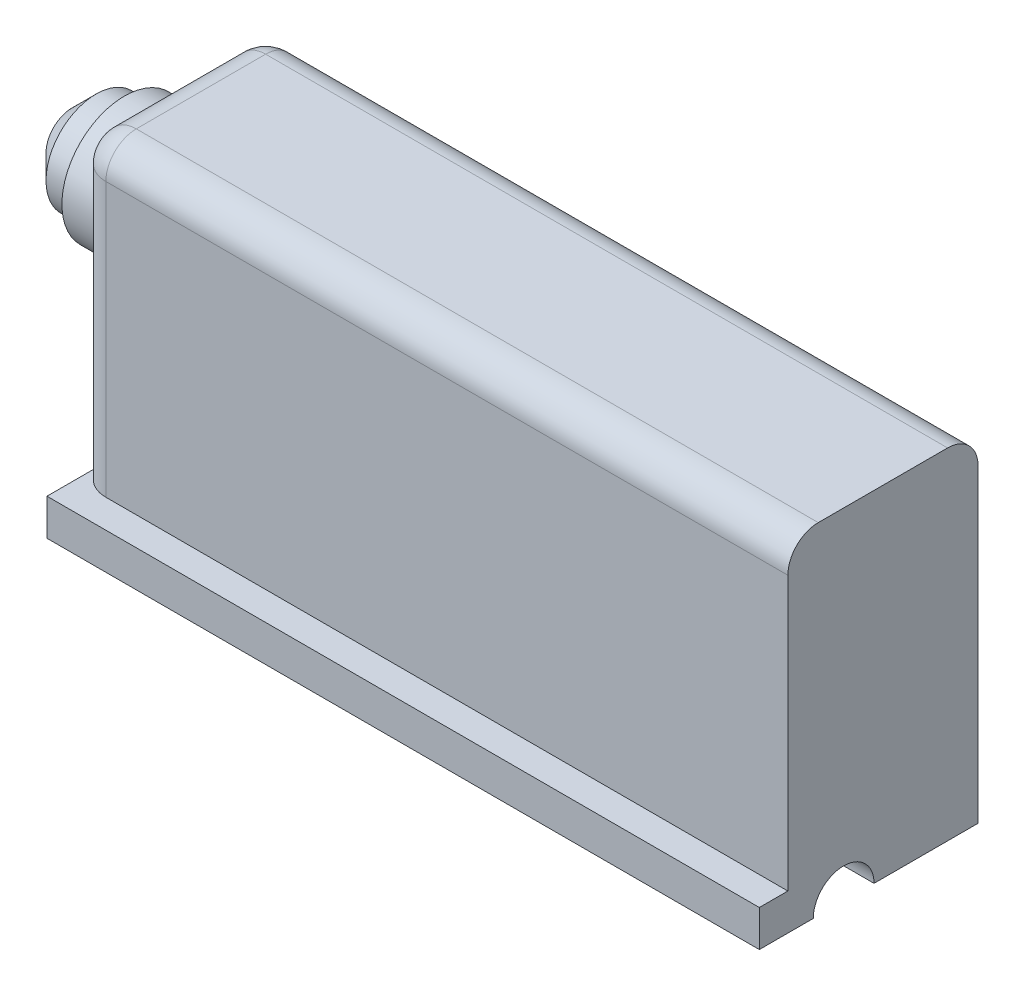
ISO-10303-21;
HEADER;
FILE_DESCRIPTION(('STEP AP214'),'2;1');
FILE_NAME('part.step','',(''),(''),'','','');
FILE_SCHEMA(('AUTOMOTIVE_DESIGN { 1 0 10303 214 1 1 1 1 }'));
ENDSEC;
DATA;
#1=APPLICATION_CONTEXT('core data for automotive mechanical design processes');
#2=APPLICATION_PROTOCOL_DEFINITION('international standard','automotive_design',2000,#1);
#3=PRODUCT_CONTEXT('',#1,'mechanical');
#4=PRODUCT('Part','Part','',(#3));
#5=PRODUCT_RELATED_PRODUCT_CATEGORY('part','',(#4));
#6=PRODUCT_DEFINITION_FORMATION('','',#4);
#7=PRODUCT_DEFINITION_CONTEXT('part definition',#1,'design');
#8=PRODUCT_DEFINITION('design','',#6,#7);
#9=PRODUCT_DEFINITION_SHAPE('','',#8);
#10=(LENGTH_UNIT() NAMED_UNIT(*) SI_UNIT(.MILLI.,.METRE.));
#11=(NAMED_UNIT(*) PLANE_ANGLE_UNIT() SI_UNIT($,.RADIAN.));
#12=(NAMED_UNIT(*) SI_UNIT($,.STERADIAN.) SOLID_ANGLE_UNIT());
#13=UNCERTAINTY_MEASURE_WITH_UNIT(LENGTH_MEASURE(1.E-05),#10,'distance_accuracy_value','');
#14=(GEOMETRIC_REPRESENTATION_CONTEXT(3) GLOBAL_UNCERTAINTY_ASSIGNED_CONTEXT((#13)) GLOBAL_UNIT_ASSIGNED_CONTEXT((#10,
#11,#12)) REPRESENTATION_CONTEXT('',''));
#15=CARTESIAN_POINT('',(0.,0.,0.));
#16=DIRECTION('',(0.,0.,1.));
#17=DIRECTION('',(1.,0.,0.));
#18=AXIS2_PLACEMENT_3D('',#15,#16,#17);
#19=CARTESIAN_POINT('',(12.7,129.54,-170.0784));
#20=DIRECTION('',(1.,0.,0.));
#21=DIRECTION('',(0.,0.,-1.));
#22=AXIS2_PLACEMENT_3D('',#19,#20,#21);
#23=SPHERICAL_SURFACE('',#22,12.7);
#24=CARTESIAN_POINT('',(12.7,129.54,-170.0784));
#25=DIRECTION('',(0.,-1.,0.));
#26=DIRECTION('',(0.,0.,-1.));
#27=AXIS2_PLACEMENT_3D('',#24,#25,#26);
#28=CIRCLE('',#27,12.7);
#29=CARTESIAN_POINT('',(0.,129.54,-170.0784));
#30=VERTEX_POINT('',#29);
#31=CARTESIAN_POINT('',(12.7,129.54,-182.7784));
#32=VERTEX_POINT('',#31);
#33=EDGE_CURVE('E383',#30,#32,#28,.T.);
#34=ORIENTED_EDGE('',*,*,#33,.F.);
#35=CARTESIAN_POINT('',(12.7,129.54,-170.0784));
#36=DIRECTION('',(0.,0.,-1.));
#37=DIRECTION('',(-1.,0.,0.));
#38=AXIS2_PLACEMENT_3D('',#35,#36,#37);
#39=CIRCLE('',#38,12.7);
#40=CARTESIAN_POINT('',(12.7,142.24,-170.0784));
#41=VERTEX_POINT('',#40);
#42=EDGE_CURVE('E380',#30,#41,#39,.T.);
#43=ORIENTED_EDGE('',*,*,#42,.T.);
#44=CARTESIAN_POINT('',(12.7,129.54,-170.0784));
#45=DIRECTION('',(-1.,0.,0.));
#46=DIRECTION('',(0.,0.,1.));
#47=AXIS2_PLACEMENT_3D('',#44,#45,#46);
#48=CIRCLE('',#47,12.7);
#49=EDGE_CURVE('E361',#32,#41,#48,.F.);
#50=ORIENTED_EDGE('',*,*,#49,.F.);
#51=EDGE_LOOP('',(#34,#43,#50));
#52=FACE_BOUND('',#51,.T.);
#53=ADVANCED_FACE('F41',(#52),#23,.T.);
#54=CARTESIAN_POINT('',(12.7,129.54,0.));
#55=DIRECTION('',(0.,0.,1.));
#56=DIRECTION('',(1.,0.,0.));
#57=AXIS2_PLACEMENT_3D('',#54,#55,#56);
#58=CYLINDRICAL_SURFACE('',#57,12.7);
#59=ORIENTED_EDGE('',*,*,#42,.F.);
#60=DIRECTION('',(0.,0.,-1.));
#61=VECTOR('',#60,1.);
#62=CARTESIAN_POINT('',(0.,129.54,0.));
#63=LINE('',#62,#61);
#64=CARTESIAN_POINT('',(0.,129.54,-116.011120576499));
#65=VERTEX_POINT('',#64);
#66=EDGE_CURVE('E341',#65,#30,#63,.T.);
#67=ORIENTED_EDGE('',*,*,#66,.F.);
#68=CARTESIAN_POINT('',(12.7,129.54,-116.011120576499));
#69=DIRECTION('',(0.,0.,-1.));
#70=DIRECTION('',(-1.,0.,0.));
#71=AXIS2_PLACEMENT_3D('',#68,#69,#70);
#72=CIRCLE('',#71,12.7);
#73=CARTESIAN_POINT('',(12.7,142.24,-116.011120576499));
#74=VERTEX_POINT('',#73);
#75=EDGE_CURVE('E377',#65,#74,#72,.T.);
#76=ORIENTED_EDGE('',*,*,#75,.T.);
#77=DIRECTION('',(0.,0.,-1.));
#78=VECTOR('',#77,1.);
#79=CARTESIAN_POINT('',(12.7,142.24,0.));
#80=LINE('',#79,#78);
#81=EDGE_CURVE('E357',#41,#74,#80,.F.);
#82=ORIENTED_EDGE('',*,*,#81,.F.);
#83=EDGE_LOOP('',(#59,#67,#76,#82));
#84=FACE_BOUND('',#83,.T.);
#85=ADVANCED_FACE('F407',(#84),#58,.T.);
#86=CARTESIAN_POINT('',(12.7,129.54,-116.011120576499));
#87=DIRECTION('',(1.,0.,0.));
#88=DIRECTION('',(0.,0.,-1.));
#89=AXIS2_PLACEMENT_3D('',#86,#87,#88);
#90=SPHERICAL_SURFACE('',#89,12.7);
#91=ORIENTED_EDGE('',*,*,#75,.F.);
#92=CARTESIAN_POINT('',(12.7,129.54,-116.011120576499));
#93=DIRECTION('',(0.,1.,0.));
#94=DIRECTION('',(0.,0.,1.));
#95=AXIS2_PLACEMENT_3D('',#92,#93,#94);
#96=CIRCLE('',#95,12.7);
#97=CARTESIAN_POINT('',(12.7,129.54,-103.311120576499));
#98=VERTEX_POINT('',#97);
#99=EDGE_CURVE('E374',#65,#98,#96,.T.);
#100=ORIENTED_EDGE('',*,*,#99,.T.);
#101=CARTESIAN_POINT('',(12.7,129.54,-116.011120576499));
#102=DIRECTION('',(1.,0.,0.));
#103=DIRECTION('',(0.,0.,-1.));
#104=AXIS2_PLACEMENT_3D('',#101,#102,#103);
#105=CIRCLE('',#104,12.7);
#106=EDGE_CURVE('E353',#74,#98,#105,.T.);
#107=ORIENTED_EDGE('',*,*,#106,.F.);
#108=EDGE_LOOP('',(#91,#100,#107));
#109=FACE_BOUND('',#108,.T.);
#110=ADVANCED_FACE('F414',(#109),#90,.T.);
#111=CARTESIAN_POINT('',(12.7,15.24,-116.011120576499));
#112=DIRECTION('',(0.,1.,0.));
#113=DIRECTION('',(0.,0.,1.));
#114=AXIS2_PLACEMENT_3D('',#111,#112,#113);
#115=CYLINDRICAL_SURFACE('',#114,12.7);
#116=ORIENTED_EDGE('',*,*,#99,.F.);
#117=DIRECTION('',(0.,1.,0.));
#118=VECTOR('',#117,1.);
#119=CARTESIAN_POINT('',(0.,15.24,-116.011120576499));
#120=LINE('',#119,#118);
#121=CARTESIAN_POINT('',(0.,15.24,-116.011120576499));
#122=VERTEX_POINT('',#121);
#123=EDGE_CURVE('E345',#122,#65,#120,.T.);
#124=ORIENTED_EDGE('',*,*,#123,.F.);
#125=CARTESIAN_POINT('',(12.7,15.24,-116.011120576499));
#126=DIRECTION('',(0.,-1.,0.));
#127=DIRECTION('',(0.,0.,-1.));
#128=AXIS2_PLACEMENT_3D('',#125,#126,#127);
#129=CIRCLE('',#128,12.7);
#130=CARTESIAN_POINT('',(12.7,15.24,-103.311120576499));
#131=VERTEX_POINT('',#130);
#132=EDGE_CURVE('E371',#122,#131,#129,.F.);
#133=ORIENTED_EDGE('',*,*,#132,.T.);
#134=DIRECTION('',(0.,1.,0.));
#135=VECTOR('',#134,1.);
#136=CARTESIAN_POINT('',(12.7,142.24,-103.311120576499));
#137=LINE('',#136,#135);
#138=EDGE_CURVE('E349',#98,#131,#137,.F.);
#139=ORIENTED_EDGE('',*,*,#138,.F.);
#140=EDGE_LOOP('',(#116,#124,#133,#139));
#141=FACE_BOUND('',#140,.T.);
#142=ADVANCED_FACE('F421',(#141),#115,.T.);
#143=CARTESIAN_POINT('',(12.7,15.24,-170.0784));
#144=DIRECTION('',(0.,-1.,0.));
#145=DIRECTION('',(0.,0.,-1.));
#146=AXIS2_PLACEMENT_3D('',#143,#144,#145);
#147=CYLINDRICAL_SURFACE('',#146,12.7);
#148=DIRECTION('',(0.,-1.,0.));
#149=VECTOR('',#148,1.);
#150=CARTESIAN_POINT('',(0.,15.24,-170.0784));
#151=LINE('',#150,#149);
#152=CARTESIAN_POINT('',(0.,0.,-170.0784));
#153=VERTEX_POINT('',#152);
#154=EDGE_CURVE('E337',#30,#153,#151,.T.);
#155=ORIENTED_EDGE('',*,*,#154,.F.);
#156=ORIENTED_EDGE('',*,*,#33,.T.);
#157=DIRECTION('',(0.,-1.,0.));
#158=VECTOR('',#157,1.);
#159=CARTESIAN_POINT('',(12.7,15.24,-182.7784));
#160=LINE('',#159,#158);
#161=CARTESIAN_POINT('',(12.7,0.,-182.7784));
#162=VERTEX_POINT('',#161);
#163=EDGE_CURVE('E365',#162,#32,#160,.F.);
#164=ORIENTED_EDGE('',*,*,#163,.F.);
#165=CARTESIAN_POINT('',(12.7,0.,-170.0784));
#166=DIRECTION('',(0.,-1.,0.));
#167=DIRECTION('',(0.,0.,-1.));
#168=AXIS2_PLACEMENT_3D('',#165,#166,#167);
#169=CIRCLE('',#168,12.7);
#170=EDGE_CURVE('E66',#153,#162,#169,.T.);
#171=ORIENTED_EDGE('',*,*,#170,.F.);
#172=EDGE_LOOP('',(#155,#156,#164,#171));
#173=FACE_BOUND('',#172,.T.);
#174=ADVANCED_FACE('F418',(#173),#147,.T.);
#175=CARTESIAN_POINT('',(0.,129.54,-170.0784));
#176=DIRECTION('',(-1.,0.,0.));
#177=DIRECTION('',(0.,0.,1.));
#178=AXIS2_PLACEMENT_3D('',#175,#176,#177);
#179=CYLINDRICAL_SURFACE('',#178,12.7);
#180=DIRECTION('',(1.,0.,0.));
#181=VECTOR('',#180,1.);
#182=CARTESIAN_POINT('',(0.,129.54,-182.7784));
#183=LINE('',#182,#181);
#184=CARTESIAN_POINT('',(297.73626,129.54,-182.7784));
#185=VERTEX_POINT('',#184);
#186=EDGE_CURVE('E327',#32,#185,#183,.T.);
#187=ORIENTED_EDGE('',*,*,#186,.F.);
#188=ORIENTED_EDGE('',*,*,#49,.T.);
#189=DIRECTION('',(1.,0.,0.));
#190=VECTOR('',#189,1.);
#191=CARTESIAN_POINT('',(0.,142.24,-170.0784));
#192=LINE('',#191,#190);
#193=CARTESIAN_POINT('',(297.73626,142.24,-170.0784));
#194=VERTEX_POINT('',#193);
#195=EDGE_CURVE('E330',#194,#41,#192,.F.);
#196=ORIENTED_EDGE('',*,*,#195,.F.);
#197=CARTESIAN_POINT('',(297.73626,129.54,-170.0784));
#198=DIRECTION('',(-1.,0.,0.));
#199=DIRECTION('',(0.,0.,1.));
#200=AXIS2_PLACEMENT_3D('',#197,#198,#199);
#201=CIRCLE('',#200,12.7);
#202=EDGE_CURVE('E334',#185,#194,#201,.F.);
#203=ORIENTED_EDGE('',*,*,#202,.F.);
#204=EDGE_LOOP('',(#187,#188,#196,#203));
#205=FACE_BOUND('',#204,.T.);
#206=ADVANCED_FACE('F420',(#205),#179,.T.);
#207=CARTESIAN_POINT('',(0.,129.54,-116.011120576499));
#208=DIRECTION('',(1.,0.,0.));
#209=DIRECTION('',(0.,0.,-1.));
#210=AXIS2_PLACEMENT_3D('',#207,#208,#209);
#211=CYLINDRICAL_SURFACE('',#210,12.7);
#212=DIRECTION('',(-1.,0.,0.));
#213=VECTOR('',#212,1.);
#214=CARTESIAN_POINT('',(0.,142.24,-116.011120576499));
#215=LINE('',#214,#213);
#216=CARTESIAN_POINT('',(297.73626,142.24,-116.011120576499));
#217=VERTEX_POINT('',#216);
#218=EDGE_CURVE('E321',#74,#217,#215,.F.);
#219=ORIENTED_EDGE('',*,*,#218,.F.);
#220=ORIENTED_EDGE('',*,*,#106,.T.);
#221=DIRECTION('',(-1.,0.,0.));
#222=VECTOR('',#221,1.);
#223=CARTESIAN_POINT('',(0.,129.54,-103.311120576499));
#224=LINE('',#223,#222);
#225=CARTESIAN_POINT('',(297.73626,129.54,-103.311120576499));
#226=VERTEX_POINT('',#225);
#227=EDGE_CURVE('E317',#226,#98,#224,.T.);
#228=ORIENTED_EDGE('',*,*,#227,.F.);
#229=CARTESIAN_POINT('',(297.73626,129.54,-116.011120576499));
#230=DIRECTION('',(-1.,0.,0.));
#231=DIRECTION('',(0.,0.,1.));
#232=AXIS2_PLACEMENT_3D('',#229,#230,#231);
#233=CIRCLE('',#232,12.7);
#234=EDGE_CURVE('E324',#217,#226,#233,.F.);
#235=ORIENTED_EDGE('',*,*,#234,.F.);
#236=EDGE_LOOP('',(#219,#220,#228,#235));
#237=FACE_BOUND('',#236,.T.);
#238=ADVANCED_FACE('F427',(#237),#211,.T.);
#239=CARTESIAN_POINT('',(0.,15.24,0.));
#240=DIRECTION('',(0.,-1.,0.));
#241=DIRECTION('',(0.,0.,-1.));
#242=AXIS2_PLACEMENT_3D('',#239,#240,#241);
#243=PLANE('',#242);
#244=DIRECTION('',(1.,0.,0.));
#245=VECTOR('',#244,1.);
#246=CARTESIAN_POINT('',(0.,15.24,-103.311120576499));
#247=LINE('',#246,#245);
#248=CARTESIAN_POINT('',(297.73626,15.24,-103.311120576499));
#249=VERTEX_POINT('',#248);
#250=EDGE_CURVE('E253',#131,#249,#247,.T.);
#251=ORIENTED_EDGE('',*,*,#250,.F.);
#252=ORIENTED_EDGE('',*,*,#132,.F.);
#253=DIRECTION('',(0.,0.,1.));
#254=VECTOR('',#253,1.);
#255=CARTESIAN_POINT('',(0.,15.24,0.));
#256=LINE('',#255,#254);
#257=CARTESIAN_POINT('',(0.,15.24,-91.3892));
#258=VERTEX_POINT('',#257);
#259=EDGE_CURVE('E296',#122,#258,#256,.T.);
#260=ORIENTED_EDGE('',*,*,#259,.T.);
#261=DIRECTION('',(-1.,0.,0.));
#262=VECTOR('',#261,1.);
#263=CARTESIAN_POINT('',(297.73626,15.24,-91.3892));
#264=LINE('',#263,#262);
#265=CARTESIAN_POINT('',(297.73626,15.24,-91.3892));
#266=VERTEX_POINT('',#265);
#267=EDGE_CURVE('E273',#266,#258,#264,.T.);
#268=ORIENTED_EDGE('',*,*,#267,.F.);
#269=DIRECTION('',(0.,0.,-1.));
#270=VECTOR('',#269,1.);
#271=CARTESIAN_POINT('',(297.73626,15.24,0.));
#272=LINE('',#271,#270);
#273=EDGE_CURVE('E299',#266,#249,#272,.T.);
#274=ORIENTED_EDGE('',*,*,#273,.T.);
#275=EDGE_LOOP('',(#251,#252,#260,#268,#274));
#276=FACE_BOUND('',#275,.T.);
#277=ADVANCED_FACE('F517',(#276),#243,.F.);
#278=CARTESIAN_POINT('',(0.,15.24,0.));
#279=DIRECTION('',(1.,0.,0.));
#280=DIRECTION('',(0.,0.,-1.));
#281=AXIS2_PLACEMENT_3D('',#278,#279,#280);
#282=PLANE('',#281);
#283=CARTESIAN_POINT('',(0.,98.490679767836,-143.04476028825));
#284=DIRECTION('',(1.,0.,0.));
#285=DIRECTION('',(0.,0.,-1.));
#286=AXIS2_PLACEMENT_3D('',#283,#284,#285);
#287=CIRCLE('',#286,26.1045410140809);
#288=CARTESIAN_POINT('',(0.,98.490679767836,-169.14930130233));
#289=VERTEX_POINT('',#288);
#290=EDGE_CURVE('E248',#289,#289,#287,.F.);
#291=ORIENTED_EDGE('',*,*,#290,.F.);
#292=EDGE_LOOP('',(#291));
#293=FACE_BOUND('',#292,.T.);
#294=ORIENTED_EDGE('',*,*,#259,.F.);
#295=ORIENTED_EDGE('',*,*,#123,.T.);
#296=ORIENTED_EDGE('',*,*,#66,.T.);
#297=ORIENTED_EDGE('',*,*,#154,.T.);
#298=DIRECTION('',(0.,0.,1.));
#299=VECTOR('',#298,1.);
#300=CARTESIAN_POINT('',(0.,0.,0.));
#301=LINE('',#300,#299);
#302=CARTESIAN_POINT('',(0.,0.,-139.32408));
#303=VERTEX_POINT('',#302);
#304=EDGE_CURVE('E305',#153,#303,#301,.T.);
#305=ORIENTED_EDGE('',*,*,#304,.T.);
#306=CARTESIAN_POINT('',(0.,0.,-126.62408));
#307=DIRECTION('',(-1.,0.,0.));
#308=DIRECTION('',(0.,0.,1.));
#309=AXIS2_PLACEMENT_3D('',#306,#307,#308);
#310=CIRCLE('',#309,12.7);
#311=CARTESIAN_POINT('',(0.,0.,-113.92408));
#312=VERTEX_POINT('',#311);
#313=EDGE_CURVE('E277',#312,#303,#310,.T.);
#314=ORIENTED_EDGE('',*,*,#313,.F.);
#315=CARTESIAN_POINT('',(0.,0.,-91.3892));
#316=VERTEX_POINT('',#315);
#317=EDGE_CURVE('E293',#312,#316,#301,.T.);
#318=ORIENTED_EDGE('',*,*,#317,.T.);
#319=DIRECTION('',(0.,-1.,0.));
#320=VECTOR('',#319,1.);
#321=CARTESIAN_POINT('',(0.,0.,-91.3892));
#322=LINE('',#321,#320);
#323=EDGE_CURVE('E265',#258,#316,#322,.T.);
#324=ORIENTED_EDGE('',*,*,#323,.F.);
#325=EDGE_LOOP('',(#294,#295,#296,#297,#305,#314,#318,#324));
#326=FACE_BOUND('',#325,.T.);
#327=ADVANCED_FACE('F434',(#293,#326),#282,.F.);
#328=CARTESIAN_POINT('',(297.73626,15.24,0.));
#329=DIRECTION('',(-1.,0.,0.));
#330=DIRECTION('',(0.,0.,1.));
#331=AXIS2_PLACEMENT_3D('',#328,#329,#330);
#332=PLANE('',#331);
#333=DIRECTION('',(0.,-1.,0.));
#334=VECTOR('',#333,1.);
#335=CARTESIAN_POINT('',(297.73626,15.24,-182.7784));
#336=LINE('',#335,#334);
#337=CARTESIAN_POINT('',(297.73626,0.,-182.7784));
#338=VERTEX_POINT('',#337);
#339=EDGE_CURVE('E304',#185,#338,#336,.T.);
#340=ORIENTED_EDGE('',*,*,#339,.F.);
#341=ORIENTED_EDGE('',*,*,#202,.T.);
#342=DIRECTION('',(0.,0.,-1.));
#343=VECTOR('',#342,1.);
#344=CARTESIAN_POINT('',(297.73626,142.24,-182.7784));
#345=LINE('',#344,#343);
#346=EDGE_CURVE('E255',#217,#194,#345,.T.);
#347=ORIENTED_EDGE('',*,*,#346,.F.);
#348=ORIENTED_EDGE('',*,*,#234,.T.);
#349=DIRECTION('',(0.,-1.,0.));
#350=VECTOR('',#349,1.);
#351=CARTESIAN_POINT('',(297.73626,142.24,-103.311120576499));
#352=LINE('',#351,#350);
#353=EDGE_CURVE('E259',#226,#249,#352,.T.);
#354=ORIENTED_EDGE('',*,*,#353,.T.);
#355=ORIENTED_EDGE('',*,*,#273,.F.);
#356=DIRECTION('',(0.,-1.,0.));
#357=VECTOR('',#356,1.);
#358=CARTESIAN_POINT('',(297.73626,0.,-91.3892));
#359=LINE('',#358,#357);
#360=CARTESIAN_POINT('',(297.73626,0.,-91.3892));
#361=VERTEX_POINT('',#360);
#362=EDGE_CURVE('E266',#266,#361,#359,.T.);
#363=ORIENTED_EDGE('',*,*,#362,.T.);
#364=DIRECTION('',(0.,0.,-1.));
#365=VECTOR('',#364,1.);
#366=CARTESIAN_POINT('',(297.73626,0.,0.));
#367=LINE('',#366,#365);
#368=CARTESIAN_POINT('',(297.73626,0.,-113.92408));
#369=VERTEX_POINT('',#368);
#370=EDGE_CURVE('E309',#361,#369,#367,.T.);
#371=ORIENTED_EDGE('',*,*,#370,.T.);
#372=CARTESIAN_POINT('',(297.73626,0.,-126.62408));
#373=DIRECTION('',(-1.,0.,0.));
#374=DIRECTION('',(0.,0.,1.));
#375=AXIS2_PLACEMENT_3D('',#372,#373,#374);
#376=CIRCLE('',#375,12.7);
#377=CARTESIAN_POINT('',(297.73626,0.,-139.32408));
#378=VERTEX_POINT('',#377);
#379=EDGE_CURVE('E281',#369,#378,#376,.T.);
#380=ORIENTED_EDGE('',*,*,#379,.T.);
#381=EDGE_CURVE('E308',#378,#338,#367,.T.);
#382=ORIENTED_EDGE('',*,*,#381,.T.);
#383=EDGE_LOOP('',(#340,#341,#347,#348,#354,#355,#363,#371,#380,#382));
#384=FACE_BOUND('',#383,.T.);
#385=ADVANCED_FACE('F446',(#384),#332,.F.);
#386=CARTESIAN_POINT('',(0.,0.,0.));
#387=DIRECTION('',(0.,-1.,0.));
#388=DIRECTION('',(0.,0.,-1.));
#389=AXIS2_PLACEMENT_3D('',#386,#387,#388);
#390=PLANE('',#389);
#391=DIRECTION('',(-1.,0.,0.));
#392=VECTOR('',#391,1.);
#393=CARTESIAN_POINT('',(297.73626,0.,-91.3892));
#394=LINE('',#393,#392);
#395=EDGE_CURVE('E270',#361,#316,#394,.T.);
#396=ORIENTED_EDGE('',*,*,#395,.T.);
#397=ORIENTED_EDGE('',*,*,#317,.F.);
#398=DIRECTION('',(-1.,0.,0.));
#399=VECTOR('',#398,1.);
#400=CARTESIAN_POINT('',(297.73626,0.,-113.92408));
#401=LINE('',#400,#399);
#402=EDGE_CURVE('E285',#369,#312,#401,.T.);
#403=ORIENTED_EDGE('',*,*,#402,.F.);
#404=ORIENTED_EDGE('',*,*,#370,.F.);
#405=EDGE_LOOP('',(#396,#397,#403,#404));
#406=FACE_BOUND('',#405,.T.);
#407=ADVANCED_FACE('F450',(#406),#390,.T.);
#408=CARTESIAN_POINT('',(0.,15.24,-182.7784));
#409=DIRECTION('',(0.,0.,1.));
#410=DIRECTION('',(1.,0.,0.));
#411=AXIS2_PLACEMENT_3D('',#408,#409,#410);
#412=PLANE('',#411);
#413=DIRECTION('',(-1.,0.,0.));
#414=VECTOR('',#413,1.);
#415=CARTESIAN_POINT('',(0.,0.,-182.7784));
#416=LINE('',#415,#414);
#417=EDGE_CURVE('E300',#338,#162,#416,.T.);
#418=ORIENTED_EDGE('',*,*,#417,.T.);
#419=ORIENTED_EDGE('',*,*,#163,.T.);
#420=ORIENTED_EDGE('',*,*,#186,.T.);
#421=ORIENTED_EDGE('',*,*,#339,.T.);
#422=EDGE_LOOP('',(#418,#419,#420,#421));
#423=FACE_BOUND('',#422,.T.);
#424=ADVANCED_FACE('F523',(#423),#412,.F.);
#425=ORIENTED_EDGE('',*,*,#304,.F.);
#426=ORIENTED_EDGE('',*,*,#170,.T.);
#427=ORIENTED_EDGE('',*,*,#417,.F.);
#428=ORIENTED_EDGE('',*,*,#381,.F.);
#429=DIRECTION('',(-1.,0.,0.));
#430=VECTOR('',#429,1.);
#431=CARTESIAN_POINT('',(297.73626,0.,-139.32408));
#432=LINE('',#431,#430);
#433=EDGE_CURVE('E289',#378,#303,#432,.T.);
#434=ORIENTED_EDGE('',*,*,#433,.T.);
#435=EDGE_LOOP('',(#425,#426,#427,#428,#434));
#436=FACE_BOUND('',#435,.T.);
#437=ADVANCED_FACE('F437',(#436),#390,.T.);
#438=CARTESIAN_POINT('',(297.73626,0.,-126.62408));
#439=DIRECTION('',(-1.,0.,0.));
#440=DIRECTION('',(0.,0.,1.));
#441=AXIS2_PLACEMENT_3D('',#438,#439,#440);
#442=CYLINDRICAL_SURFACE('',#441,12.7);
#443=ORIENTED_EDGE('',*,*,#313,.T.);
#444=ORIENTED_EDGE('',*,*,#433,.F.);
#445=ORIENTED_EDGE('',*,*,#379,.F.);
#446=ORIENTED_EDGE('',*,*,#402,.T.);
#447=EDGE_LOOP('',(#443,#444,#445,#446));
#448=FACE_BOUND('',#447,.T.);
#449=ADVANCED_FACE('F442',(#448),#442,.F.);
#450=CARTESIAN_POINT('',(297.73626,0.,-91.3892));
#451=DIRECTION('',(0.,0.,-1.));
#452=DIRECTION('',(-1.,0.,0.));
#453=AXIS2_PLACEMENT_3D('',#450,#451,#452);
#454=PLANE('',#453);
#455=ORIENTED_EDGE('',*,*,#323,.T.);
#456=ORIENTED_EDGE('',*,*,#395,.F.);
#457=ORIENTED_EDGE('',*,*,#362,.F.);
#458=ORIENTED_EDGE('',*,*,#267,.T.);
#459=EDGE_LOOP('',(#455,#456,#457,#458));
#460=FACE_BOUND('',#459,.T.);
#461=ADVANCED_FACE('F510',(#460),#454,.F.);
#462=CARTESIAN_POINT('',(0.,142.24,-103.311120576499));
#463=DIRECTION('',(0.,0.,-1.));
#464=DIRECTION('',(-1.,0.,0.));
#465=AXIS2_PLACEMENT_3D('',#462,#463,#464);
#466=PLANE('',#465);
#467=ORIENTED_EDGE('',*,*,#227,.T.);
#468=ORIENTED_EDGE('',*,*,#138,.T.);
#469=ORIENTED_EDGE('',*,*,#250,.T.);
#470=ORIENTED_EDGE('',*,*,#353,.F.);
#471=EDGE_LOOP('',(#467,#468,#469,#470));
#472=FACE_BOUND('',#471,.T.);
#473=ADVANCED_FACE('F506',(#472),#466,.F.);
#474=CARTESIAN_POINT('',(0.,142.24,0.));
#475=DIRECTION('',(0.,1.,0.));
#476=DIRECTION('',(0.,0.,1.));
#477=AXIS2_PLACEMENT_3D('',#474,#475,#476);
#478=PLANE('',#477);
#479=ORIENTED_EDGE('',*,*,#195,.T.);
#480=ORIENTED_EDGE('',*,*,#81,.T.);
#481=ORIENTED_EDGE('',*,*,#218,.T.);
#482=ORIENTED_EDGE('',*,*,#346,.T.);
#483=EDGE_LOOP('',(#479,#480,#481,#482));
#484=FACE_BOUND('',#483,.T.);
#485=ADVANCED_FACE('F502',(#484),#478,.T.);
#486=CARTESIAN_POINT('',(-19.304,98.490679767836,-143.04476028825));
#487=DIRECTION('',(1.,0.,0.));
#488=DIRECTION('',(0.,0.,-1.));
#489=AXIS2_PLACEMENT_3D('',#486,#487,#488);
#490=CYLINDRICAL_SURFACE('',#489,26.1045410140809);
#491=CARTESIAN_POINT('',(-19.304,98.490679767836,-143.04476028825));
#492=DIRECTION('',(-1.,0.,0.));
#493=DIRECTION('',(0.,0.,1.));
#494=AXIS2_PLACEMENT_3D('',#491,#492,#493);
#495=CIRCLE('',#494,26.1045410140809);
#496=CARTESIAN_POINT('',(-19.304,98.490679767836,-169.14930130233));
#497=VERTEX_POINT('',#496);
#498=EDGE_CURVE('E249',#497,#497,#495,.T.);
#499=CARTESIAN_POINT('',(-19.304,98.490679767836,-169.14930130233));
#500=CARTESIAN_POINT('',(-19.1029166666666,98.490679767836,-169.14930130233));
#501=CARTESIAN_POINT('',(-18.9018333333333,98.490679767836,-169.14930130233));
#502=CARTESIAN_POINT('',(-18.4996666666666,98.490679767836,-169.14930130233));
#503=CARTESIAN_POINT('',(-18.2985833333333,98.490679767836,-169.14930130233));
#504=CARTESIAN_POINT('',(-17.8964166666666,98.490679767836,-169.14930130233));
#505=CARTESIAN_POINT('',(-17.6953333333333,98.490679767836,-169.14930130233));
#506=CARTESIAN_POINT('',(-17.2931666666666,98.490679767836,-169.14930130233));
#507=CARTESIAN_POINT('',(-17.0920833333333,98.490679767836,-169.14930130233));
#508=CARTESIAN_POINT('',(-16.6899166666666,98.490679767836,-169.14930130233));
#509=CARTESIAN_POINT('',(-16.4888333333333,98.490679767836,-169.14930130233));
#510=CARTESIAN_POINT('',(-16.0866666666666,98.490679767836,-169.14930130233));
#511=CARTESIAN_POINT('',(-15.8855833333333,98.490679767836,-169.14930130233));
#512=CARTESIAN_POINT('',(-15.4834166666666,98.490679767836,-169.14930130233));
#513=CARTESIAN_POINT('',(-15.2823333333333,98.490679767836,-169.14930130233));
#514=CARTESIAN_POINT('',(-14.8801666666666,98.490679767836,-169.14930130233));
#515=CARTESIAN_POINT('',(-14.6790833333333,98.490679767836,-169.14930130233));
#516=CARTESIAN_POINT('',(-14.2769166666666,98.490679767836,-169.14930130233));
#517=CARTESIAN_POINT('',(-14.0758333333333,98.490679767836,-169.14930130233));
#518=CARTESIAN_POINT('',(-13.6736666666666,98.490679767836,-169.14930130233));
#519=CARTESIAN_POINT('',(-13.4725833333333,98.490679767836,-169.14930130233));
#520=CARTESIAN_POINT('',(-13.0704166666666,98.490679767836,-169.14930130233));
#521=CARTESIAN_POINT('',(-12.8693333333333,98.490679767836,-169.14930130233));
#522=CARTESIAN_POINT('',(-12.4671666666666,98.490679767836,-169.14930130233));
#523=CARTESIAN_POINT('',(-12.2660833333333,98.490679767836,-169.14930130233));
#524=CARTESIAN_POINT('',(-11.8639166666666,98.490679767836,-169.14930130233));
#525=CARTESIAN_POINT('',(-11.6628333333333,98.490679767836,-169.14930130233));
#526=CARTESIAN_POINT('',(-11.2606666666666,98.490679767836,-169.14930130233));
#527=CARTESIAN_POINT('',(-11.0595833333333,98.490679767836,-169.14930130233));
#528=CARTESIAN_POINT('',(-10.6574166666666,98.490679767836,-169.14930130233));
#529=CARTESIAN_POINT('',(-10.4563333333333,98.490679767836,-169.14930130233));
#530=CARTESIAN_POINT('',(-10.0541666666666,98.490679767836,-169.14930130233));
#531=CARTESIAN_POINT('',(-9.85308333333331,98.490679767836,-169.14930130233));
#532=CARTESIAN_POINT('',(-9.45091666666665,98.490679767836,-169.14930130233));
#533=CARTESIAN_POINT('',(-9.24983333333332,98.490679767836,-169.14930130233));
#534=CARTESIAN_POINT('',(-8.84766666666665,98.490679767836,-169.14930130233));
#535=CARTESIAN_POINT('',(-8.64658333333332,98.490679767836,-169.14930130233));
#536=CARTESIAN_POINT('',(-8.24441666666665,98.490679767836,-169.14930130233));
#537=CARTESIAN_POINT('',(-8.04333333333332,98.490679767836,-169.14930130233));
#538=CARTESIAN_POINT('',(-7.64116666666665,98.490679767836,-169.14930130233));
#539=CARTESIAN_POINT('',(-7.44008333333332,98.490679767836,-169.14930130233));
#540=CARTESIAN_POINT('',(-7.03791666666665,98.490679767836,-169.14930130233));
#541=CARTESIAN_POINT('',(-6.83683333333332,98.490679767836,-169.14930130233));
#542=CARTESIAN_POINT('',(-6.43466666666666,98.490679767836,-169.14930130233));
#543=CARTESIAN_POINT('',(-6.23358333333332,98.490679767836,-169.14930130233));
#544=CARTESIAN_POINT('',(-5.83141666666666,98.490679767836,-169.14930130233));
#545=CARTESIAN_POINT('',(-5.63033333333332,98.490679767836,-169.14930130233));
#546=CARTESIAN_POINT('',(-5.22816666666666,98.490679767836,-169.14930130233));
#547=CARTESIAN_POINT('',(-5.02708333333333,98.490679767836,-169.14930130233));
#548=CARTESIAN_POINT('',(-4.62491666666666,98.490679767836,-169.14930130233));
#549=CARTESIAN_POINT('',(-4.42383333333333,98.490679767836,-169.14930130233));
#550=CARTESIAN_POINT('',(-4.02166666666666,98.490679767836,-169.14930130233));
#551=CARTESIAN_POINT('',(-3.82058333333333,98.490679767836,-169.14930130233));
#552=CARTESIAN_POINT('',(-3.41841666666666,98.490679767836,-169.14930130233));
#553=CARTESIAN_POINT('',(-3.21733333333333,98.490679767836,-169.14930130233));
#554=CARTESIAN_POINT('',(-2.81516666666667,98.490679767836,-169.14930130233));
#555=CARTESIAN_POINT('',(-2.61408333333333,98.490679767836,-169.14930130233));
#556=CARTESIAN_POINT('',(-2.21191666666667,98.490679767836,-169.14930130233));
#557=CARTESIAN_POINT('',(-2.01083333333333,98.490679767836,-169.14930130233));
#558=CARTESIAN_POINT('',(-1.60866666666667,98.490679767836,-169.14930130233));
#559=CARTESIAN_POINT('',(-1.40758333333333,98.490679767836,-169.14930130233));
#560=CARTESIAN_POINT('',(-1.00541666666667,98.490679767836,-169.14930130233));
#561=CARTESIAN_POINT('',(-0.804333333333335,98.490679767836,-169.14930130233));
#562=CARTESIAN_POINT('',(-0.40216666666667,98.490679767836,-169.14930130233));
#563=CARTESIAN_POINT('',(-0.201083333333337,98.490679767836,-169.14930130233));
#564=CARTESIAN_POINT('',(0.,98.490679767836,-169.14930130233));
#565=B_SPLINE_CURVE_WITH_KNOTS('',3,(#499,#500,#501,#502,#503,#504,#505,#506,#507,#508,#509,
#510,#511,#512,#513,#514,#515,#516,#517,#518,#519,#520,#521,#522,#523,#524,#525,#526,#527,#528,
#529,#530,#531,#532,#533,#534,#535,#536,#537,#538,#539,#540,#541,#542,#543,#544,#545,#546,#547,
#548,#549,#550,#551,#552,#553,#554,#555,#556,#557,#558,#559,#560,#561,#562,#563,#564),
.UNSPECIFIED.,.F.,.F.,(4,2,2,2,2,2,2,2,2,2,2,2,2,2,2,2,2,2,2,2,2,2,2,2,2,2,2,2,2,2,2,2,4),(0.,
0.603249999999996,1.2065,1.80975,2.41299999999999,3.01624999999999,3.61949999999999,
4.22274999999999,4.82599999999999,5.42924999999999,6.03249999999998,6.63574999999998,
7.23899999999998,7.84224999999998,8.44549999999998,9.04874999999998,9.65199999999997,10.25525,
10.8585,11.46175,12.065,12.66825,13.2715,13.87475,14.478,15.08125,15.6845,16.28775,16.891,
17.49425,18.0975,18.70075,19.304),.UNSPECIFIED.);
#566=EDGE_CURVE('BSEAM498',#497,#289,#565,.T.);
#567=ORIENTED_EDGE('',*,*,#498,.F.);
#568=ORIENTED_EDGE('',*,*,#290,.T.);
#569=ORIENTED_EDGE('',*,*,#566,.T.);
#570=ORIENTED_EDGE('',*,*,#566,.F.);
#571=EDGE_LOOP('',(#567,#569,#568,#570));
#572=FACE_BOUND('',#571,.T.);
#573=ADVANCED_FACE('F498',(#572),#490,.T.);
#574=CARTESIAN_POINT('',(-19.304,98.490679767836,-143.04476028825));
#575=DIRECTION('',(-1.,0.,0.));
#576=DIRECTION('',(0.,0.,1.));
#577=AXIS2_PLACEMENT_3D('',#574,#575,#576);
#578=PLANE('',#577);
#579=CARTESIAN_POINT('',(-19.304,98.490679767836,-143.04476028825));
#580=DIRECTION('',(-1.,0.,0.));
#581=DIRECTION('',(0.,0.,1.));
#582=AXIS2_PLACEMENT_3D('',#579,#580,#581);
#583=CIRCLE('',#582,20.9136875158982);
#584=CARTESIAN_POINT('',(-19.304,98.490679767836,-122.131072772351));
#585=VERTEX_POINT('',#584);
#586=EDGE_CURVE('E244',#585,#585,#583,.T.);
#587=ORIENTED_EDGE('',*,*,#586,.F.);
#588=EDGE_LOOP('',(#587));
#589=FACE_BOUND('',#588,.T.);
#590=ORIENTED_EDGE('',*,*,#498,.T.);
#591=EDGE_LOOP('',(#590));
#592=FACE_BOUND('',#591,.T.);
#593=ADVANCED_FACE('F494',(#589,#592),#578,.T.);
#594=CARTESIAN_POINT('',(-41.1479999999999,98.490679767836,-143.04476028825));
#595=DIRECTION('',(1.,0.,0.));
#596=DIRECTION('',(0.,0.,-1.));
#597=AXIS2_PLACEMENT_3D('',#594,#595,#596);
#598=CYLINDRICAL_SURFACE('',#597,20.9136875158982);
#599=CARTESIAN_POINT('',(-31.1479999999998,98.490679767836,-143.04476028825));
#600=DIRECTION('',(-1.,0.,0.));
#601=DIRECTION('',(0.,0.,1.));
#602=AXIS2_PLACEMENT_3D('',#599,#600,#601);
#603=CIRCLE('',#602,20.9136875158982);
#604=CARTESIAN_POINT('',(-31.1479999999998,98.490679767836,-122.131072772351));
#605=VERTEX_POINT('',#604);
#606=EDGE_CURVE('E11',#605,#605,#603,.F.);
#607=ORIENTED_EDGE('',*,*,#606,.T.);
#608=EDGE_LOOP('',(#607));
#609=FACE_BOUND('',#608,.T.);
#610=ORIENTED_EDGE('',*,*,#586,.T.);
#611=EDGE_LOOP('',(#610));
#612=FACE_BOUND('',#611,.T.);
#613=ADVANCED_FACE('F402',(#609,#612),#598,.T.);
#614=CARTESIAN_POINT('',(-41.1479999999999,98.490679767836,-143.04476028825));
#615=DIRECTION('',(-1.,0.,0.));
#616=DIRECTION('',(0.,0.,1.));
#617=AXIS2_PLACEMENT_3D('',#614,#615,#616);
#618=PLANE('',#617);
#619=CARTESIAN_POINT('',(-41.1479999999999,98.490679767836,-143.04476028825));
#620=DIRECTION('',(-1.,0.,0.));
#621=DIRECTION('',(0.,0.,1.));
#622=AXIS2_PLACEMENT_3D('',#619,#620,#621);
#623=CIRCLE('',#622,4.37644656081155);
#624=CARTESIAN_POINT('',(-41.1479999999999,98.490679767836,-138.668313727438));
#625=VERTEX_POINT('',#624);
#626=EDGE_CURVE('E200',#625,#625,#623,.T.);
#627=ORIENTED_EDGE('',*,*,#626,.F.);
#628=EDGE_LOOP('',(#627));
#629=FACE_BOUND('',#628,.T.);
#630=DIRECTION('',(0.,0.499999999999995,-0.866025403784442));
#631=VECTOR('',#630,1.);
#632=CARTESIAN_POINT('',(-41.1479999999999,99.6092059193906,-148.207440467994));
#633=LINE('',#632,#631);
#634=CARTESIAN_POINT('',(-41.1479999999999,99.6092059193906,-148.207440467994));
#635=VERTEX_POINT('',#634);
#636=CARTESIAN_POINT('',(-41.1479999999999,100.727732070945,-150.144784592081));
#637=VERTEX_POINT('',#636);
#638=EDGE_CURVE('E58',#635,#637,#633,.T.);
#639=ORIENTED_EDGE('',*,*,#638,.F.);
#640=DIRECTION('',(0.,1.,0.));
#641=VECTOR('',#640,1.);
#642=CARTESIAN_POINT('',(-41.1479999999999,97.3721536162814,-148.207440467994));
#643=LINE('',#642,#641);
#644=CARTESIAN_POINT('',(-41.1479999999999,97.3721536162814,-148.207440467994));
#645=VERTEX_POINT('',#644);
#646=EDGE_CURVE('E193',#645,#635,#643,.T.);
#647=ORIENTED_EDGE('',*,*,#646,.F.);
#648=DIRECTION('',(0.,0.500000000000009,0.866025403784433));
#649=VECTOR('',#648,1.);
#650=CARTESIAN_POINT('',(-41.1479999999999,96.2536274647268,-150.144784592081));
#651=LINE('',#650,#649);
#652=CARTESIAN_POINT('',(-41.1479999999999,96.2536274647268,-150.144784592081));
#653=VERTEX_POINT('',#652);
#654=EDGE_CURVE('E197',#653,#645,#651,.T.);
#655=ORIENTED_EDGE('',*,*,#654,.F.);
#656=DIRECTION('',(0.,-0.499999999999994,0.866025403784442));
#657=VECTOR('',#656,1.);
#658=CARTESIAN_POINT('',(-41.1479999999999,97.3721536162814,-152.082128716168));
#659=LINE('',#658,#657);
#660=CARTESIAN_POINT('',(-41.1479999999999,97.3721536162814,-152.082128716168));
#661=VERTEX_POINT('',#660);
#662=EDGE_CURVE('E223',#661,#653,#659,.T.);
#663=ORIENTED_EDGE('',*,*,#662,.F.);
#664=DIRECTION('',(0.,-1.,0.));
#665=VECTOR('',#664,1.);
#666=CARTESIAN_POINT('',(-41.1479999999999,99.6092059193906,-152.082128716168));
#667=LINE('',#666,#665);
#668=CARTESIAN_POINT('',(-41.1479999999999,99.6092059193906,-152.082128716168));
#669=VERTEX_POINT('',#668);
#670=EDGE_CURVE('E219',#669,#661,#667,.T.);
#671=ORIENTED_EDGE('',*,*,#670,.F.);
#672=DIRECTION('',(0.,-0.500000000000004,-0.866025403784436));
#673=VECTOR('',#672,1.);
#674=CARTESIAN_POINT('',(-41.1479999999999,100.727732070945,-150.144784592081));
#675=LINE('',#674,#673);
#676=EDGE_CURVE('E216',#637,#669,#675,.T.);
#677=ORIENTED_EDGE('',*,*,#676,.F.);
#678=EDGE_LOOP('',(#639,#647,#655,#663,#671,#677));
#679=FACE_BOUND('',#678,.T.);
#680=CARTESIAN_POINT('',(-41.1479999999999,98.490679767836,-143.04476028825));
#681=DIRECTION('',(-1.,0.,0.));
#682=DIRECTION('',(0.,0.,1.));
#683=AXIS2_PLACEMENT_3D('',#680,#681,#682);
#684=CIRCLE('',#683,10.9136875158981);
#685=CARTESIAN_POINT('',(-41.1479999999999,98.490679767836,-132.131072772351));
#686=VERTEX_POINT('',#685);
#687=EDGE_CURVE('E51',#686,#686,#684,.T.);
#688=ORIENTED_EDGE('',*,*,#687,.T.);
#689=EDGE_LOOP('',(#688));
#690=FACE_BOUND('',#689,.T.);
#691=ADVANCED_FACE('F392',(#629,#679,#690),#618,.T.);
#692=CARTESIAN_POINT('',(-41.1479999999999,98.490679767836,-143.04476028825));
#693=DIRECTION('',(1.,0.,0.));
#694=DIRECTION('',(0.,0.,-1.));
#695=AXIS2_PLACEMENT_3D('',#692,#693,#694);
#696=CONICAL_SURFACE('',#695,10.9136875158981,0.78539816339745);
#697=ORIENTED_EDGE('',*,*,#606,.F.);
#698=EDGE_LOOP('',(#697));
#699=FACE_BOUND('',#698,.T.);
#700=ORIENTED_EDGE('',*,*,#687,.F.);
#701=EDGE_LOOP('',(#700));
#702=FACE_BOUND('',#701,.T.);
#703=ADVANCED_FACE('F44',(#699,#702),#696,.T.);
#704=CARTESIAN_POINT('',(-19.304,99.6092059193906,-148.207440467994));
#705=DIRECTION('',(0.,0.866025403784442,0.499999999999995));
#706=DIRECTION('',(0.,-0.499999999999995,0.866025403784442));
#707=AXIS2_PLACEMENT_3D('',#704,#705,#706);
#708=PLANE('',#707);
#709=ORIENTED_EDGE('',*,*,#638,.T.);
#710=DIRECTION('',(-1.,0.,0.));
#711=VECTOR('',#710,1.);
#712=CARTESIAN_POINT('',(-19.304,100.727732070945,-150.144784592081));
#713=LINE('',#712,#711);
#714=CARTESIAN_POINT('',(-19.304,100.727732070945,-150.144784592081));
#715=VERTEX_POINT('',#714);
#716=EDGE_CURVE('E167',#715,#637,#713,.T.);
#717=ORIENTED_EDGE('',*,*,#716,.F.);
#718=DIRECTION('',(0.,0.499999999999995,-0.866025403784442));
#719=VECTOR('',#718,1.);
#720=CARTESIAN_POINT('',(-19.304,99.6092059193906,-148.207440467994));
#721=LINE('',#720,#719);
#722=CARTESIAN_POINT('',(-19.304,99.6092059193906,-148.207440467994));
#723=VERTEX_POINT('',#722);
#724=EDGE_CURVE('E171',#723,#715,#721,.T.);
#725=ORIENTED_EDGE('',*,*,#724,.F.);
#726=DIRECTION('',(-1.,0.,0.));
#727=VECTOR('',#726,1.);
#728=CARTESIAN_POINT('',(-19.304,99.6092059193906,-148.207440467994));
#729=LINE('',#728,#727);
#730=EDGE_CURVE('E230',#723,#635,#729,.T.);
#731=ORIENTED_EDGE('',*,*,#730,.T.);
#732=EDGE_LOOP('',(#709,#717,#725,#731));
#733=FACE_BOUND('',#732,.T.);
#734=ADVANCED_FACE('F169',(#733),#708,.F.);
#735=CARTESIAN_POINT('',(-19.304,97.3721536162814,-148.207440467994));
#736=DIRECTION('',(0.,0.,1.));
#737=DIRECTION('',(0.,-1.,0.));
#738=AXIS2_PLACEMENT_3D('',#735,#736,#737);
#739=PLANE('',#738);
#740=ORIENTED_EDGE('',*,*,#646,.T.);
#741=ORIENTED_EDGE('',*,*,#730,.F.);
#742=DIRECTION('',(0.,1.,0.));
#743=VECTOR('',#742,1.);
#744=CARTESIAN_POINT('',(-19.304,97.3721536162814,-148.207440467994));
#745=LINE('',#744,#743);
#746=CARTESIAN_POINT('',(-19.304,97.3721536162814,-148.207440467994));
#747=VERTEX_POINT('',#746);
#748=EDGE_CURVE('E178',#747,#723,#745,.T.);
#749=ORIENTED_EDGE('',*,*,#748,.F.);
#750=DIRECTION('',(-1.,0.,0.));
#751=VECTOR('',#750,1.);
#752=CARTESIAN_POINT('',(-19.304,97.3721536162814,-148.207440467994));
#753=LINE('',#752,#751);
#754=EDGE_CURVE('E233',#747,#645,#753,.T.);
#755=ORIENTED_EDGE('',*,*,#754,.T.);
#756=EDGE_LOOP('',(#740,#741,#749,#755));
#757=FACE_BOUND('',#756,.T.);
#758=ADVANCED_FACE('F400',(#757),#739,.F.);
#759=CARTESIAN_POINT('',(-19.304,96.2536274647268,-150.144784592081));
#760=DIRECTION('',(0.,-0.866025403784433,0.500000000000009));
#761=DIRECTION('',(0.,-0.500000000000009,-0.866025403784433));
#762=AXIS2_PLACEMENT_3D('',#759,#760,#761);
#763=PLANE('',#762);
#764=ORIENTED_EDGE('',*,*,#654,.T.);
#765=ORIENTED_EDGE('',*,*,#754,.F.);
#766=DIRECTION('',(0.,0.500000000000009,0.866025403784433));
#767=VECTOR('',#766,1.);
#768=CARTESIAN_POINT('',(-19.304,96.2536274647268,-150.144784592081));
#769=LINE('',#768,#767);
#770=CARTESIAN_POINT('',(-19.304,96.2536274647268,-150.144784592081));
#771=VERTEX_POINT('',#770);
#772=EDGE_CURVE('E209',#771,#747,#769,.T.);
#773=ORIENTED_EDGE('',*,*,#772,.F.);
#774=DIRECTION('',(-1.,0.,0.));
#775=VECTOR('',#774,1.);
#776=CARTESIAN_POINT('',(-19.304,96.2536274647268,-150.144784592081));
#777=LINE('',#776,#775);
#778=EDGE_CURVE('E236',#771,#653,#777,.T.);
#779=ORIENTED_EDGE('',*,*,#778,.T.);
#780=EDGE_LOOP('',(#764,#765,#773,#779));
#781=FACE_BOUND('',#780,.T.);
#782=ADVANCED_FACE('F475',(#781),#763,.F.);
#783=CARTESIAN_POINT('',(-19.304,97.3721536162814,-152.082128716168));
#784=DIRECTION('',(0.,-0.866025403784442,-0.499999999999994));
#785=DIRECTION('',(0.,0.499999999999994,-0.866025403784442));
#786=AXIS2_PLACEMENT_3D('',#783,#784,#785);
#787=PLANE('',#786);
#788=ORIENTED_EDGE('',*,*,#662,.T.);
#789=ORIENTED_EDGE('',*,*,#778,.F.);
#790=DIRECTION('',(0.,-0.499999999999994,0.866025403784442));
#791=VECTOR('',#790,1.);
#792=CARTESIAN_POINT('',(-19.304,97.3721536162814,-152.082128716168));
#793=LINE('',#792,#791);
#794=CARTESIAN_POINT('',(-19.304,97.3721536162814,-152.082128716168));
#795=VERTEX_POINT('',#794);
#796=EDGE_CURVE('E205',#795,#771,#793,.T.);
#797=ORIENTED_EDGE('',*,*,#796,.F.);
#798=DIRECTION('',(-1.,0.,0.));
#799=VECTOR('',#798,1.);
#800=CARTESIAN_POINT('',(-19.304,97.3721536162814,-152.082128716168));
#801=LINE('',#800,#799);
#802=EDGE_CURVE('E239',#795,#661,#801,.T.);
#803=ORIENTED_EDGE('',*,*,#802,.T.);
#804=EDGE_LOOP('',(#788,#789,#797,#803));
#805=FACE_BOUND('',#804,.T.);
#806=ADVANCED_FACE('F473',(#805),#787,.F.);
#807=CARTESIAN_POINT('',(-19.304,99.6092059193906,-152.082128716168));
#808=DIRECTION('',(0.,0.,-1.));
#809=DIRECTION('',(-1.,0.,0.));
#810=AXIS2_PLACEMENT_3D('',#807,#808,#809);
#811=PLANE('',#810);
#812=ORIENTED_EDGE('',*,*,#670,.T.);
#813=ORIENTED_EDGE('',*,*,#802,.F.);
#814=DIRECTION('',(0.,-1.,0.));
#815=VECTOR('',#814,1.);
#816=CARTESIAN_POINT('',(-19.304,99.6092059193906,-152.082128716168));
#817=LINE('',#816,#815);
#818=CARTESIAN_POINT('',(-19.304,99.6092059193906,-152.082128716168));
#819=VERTEX_POINT('',#818);
#820=EDGE_CURVE('E187',#819,#795,#817,.T.);
#821=ORIENTED_EDGE('',*,*,#820,.F.);
#822=DIRECTION('',(-1.,0.,0.));
#823=VECTOR('',#822,1.);
#824=CARTESIAN_POINT('',(-19.304,99.6092059193906,-152.082128716168));
#825=LINE('',#824,#823);
#826=EDGE_CURVE('E177',#819,#669,#825,.T.);
#827=ORIENTED_EDGE('',*,*,#826,.T.);
#828=EDGE_LOOP('',(#812,#813,#821,#827));
#829=FACE_BOUND('',#828,.T.);
#830=ADVANCED_FACE('F469',(#829),#811,.F.);
#831=CARTESIAN_POINT('',(-19.304,100.727732070945,-150.144784592081));
#832=DIRECTION('',(0.,0.866025403784436,-0.500000000000004));
#833=DIRECTION('',(0.,0.500000000000004,0.866025403784436));
#834=AXIS2_PLACEMENT_3D('',#831,#832,#833);
#835=PLANE('',#834);
#836=ORIENTED_EDGE('',*,*,#676,.T.);
#837=ORIENTED_EDGE('',*,*,#826,.F.);
#838=DIRECTION('',(0.,-0.500000000000004,-0.866025403784436));
#839=VECTOR('',#838,1.);
#840=CARTESIAN_POINT('',(-19.304,100.727732070945,-150.144784592081));
#841=LINE('',#840,#839);
#842=EDGE_CURVE('E181',#715,#819,#841,.T.);
#843=ORIENTED_EDGE('',*,*,#842,.F.);
#844=ORIENTED_EDGE('',*,*,#716,.T.);
#845=EDGE_LOOP('',(#836,#837,#843,#844));
#846=FACE_BOUND('',#845,.T.);
#847=ADVANCED_FACE('F182',(#846),#835,.F.);
#848=CARTESIAN_POINT('',(-19.304,0.,0.));
#849=DIRECTION('',(-1.,0.,0.));
#850=DIRECTION('',(0.,0.,1.));
#851=AXIS2_PLACEMENT_3D('',#848,#849,#850);
#852=PLANE('',#851);
#853=ORIENTED_EDGE('',*,*,#724,.T.);
#854=ORIENTED_EDGE('',*,*,#842,.T.);
#855=ORIENTED_EDGE('',*,*,#820,.T.);
#856=ORIENTED_EDGE('',*,*,#796,.T.);
#857=ORIENTED_EDGE('',*,*,#772,.T.);
#858=ORIENTED_EDGE('',*,*,#748,.T.);
#859=EDGE_LOOP('',(#853,#854,#855,#856,#857,#858));
#860=FACE_BOUND('',#859,.T.);
#861=ADVANCED_FACE('F189',(#860),#852,.T.);
#862=CARTESIAN_POINT('',(-19.304,98.490679767836,-143.04476028825));
#863=DIRECTION('',(-1.,0.,0.));
#864=DIRECTION('',(0.,0.,1.));
#865=AXIS2_PLACEMENT_3D('',#862,#863,#864);
#866=CYLINDRICAL_SURFACE('',#865,4.37644656081155);
#867=CARTESIAN_POINT('',(-19.304,98.490679767836,-143.04476028825));
#868=DIRECTION('',(-1.,0.,0.));
#869=DIRECTION('',(0.,0.,1.));
#870=AXIS2_PLACEMENT_3D('',#867,#868,#869);
#871=CIRCLE('',#870,4.37644656081155);
#872=CARTESIAN_POINT('',(-19.304,98.490679767836,-138.668313727438));
#873=VERTEX_POINT('',#872);
#874=EDGE_CURVE('E254',#873,#873,#871,.T.);
#875=ORIENTED_EDGE('',*,*,#874,.F.);
#876=EDGE_LOOP('',(#875));
#877=FACE_BOUND('',#876,.T.);
#878=ORIENTED_EDGE('',*,*,#626,.T.);
#879=EDGE_LOOP('',(#878));
#880=FACE_BOUND('',#879,.T.);
#881=ADVANCED_FACE('F462',(#877,#880),#866,.F.);
#882=CARTESIAN_POINT('',(-19.304,98.490679767836,-143.04476028825));
#883=DIRECTION('',(-1.,0.,0.));
#884=DIRECTION('',(0.,0.,1.));
#885=AXIS2_PLACEMENT_3D('',#882,#883,#884);
#886=PLANE('',#885);
#887=ORIENTED_EDGE('',*,*,#874,.T.);
#888=EDGE_LOOP('',(#887));
#889=FACE_BOUND('',#888,.T.);
#890=ADVANCED_FACE('F694',(#889),#886,.T.);
#891=CLOSED_SHELL('',(#53,#85,#110,#142,#174,#206,#238,#277,#327,#385,#407,#424,#437,#449,#461,
#473,#485,#573,#593,#613,#691,#703,#734,#758,#782,#806,#830,#847,#861,#881,#890));
#892=MANIFOLD_SOLID_BREP('B2',#891);
#893=ADVANCED_BREP_SHAPE_REPRESENTATION('',(#18,#892),#14);
#894=SHAPE_DEFINITION_REPRESENTATION(#9,#893);
ENDSEC;
END-ISO-10303-21;
